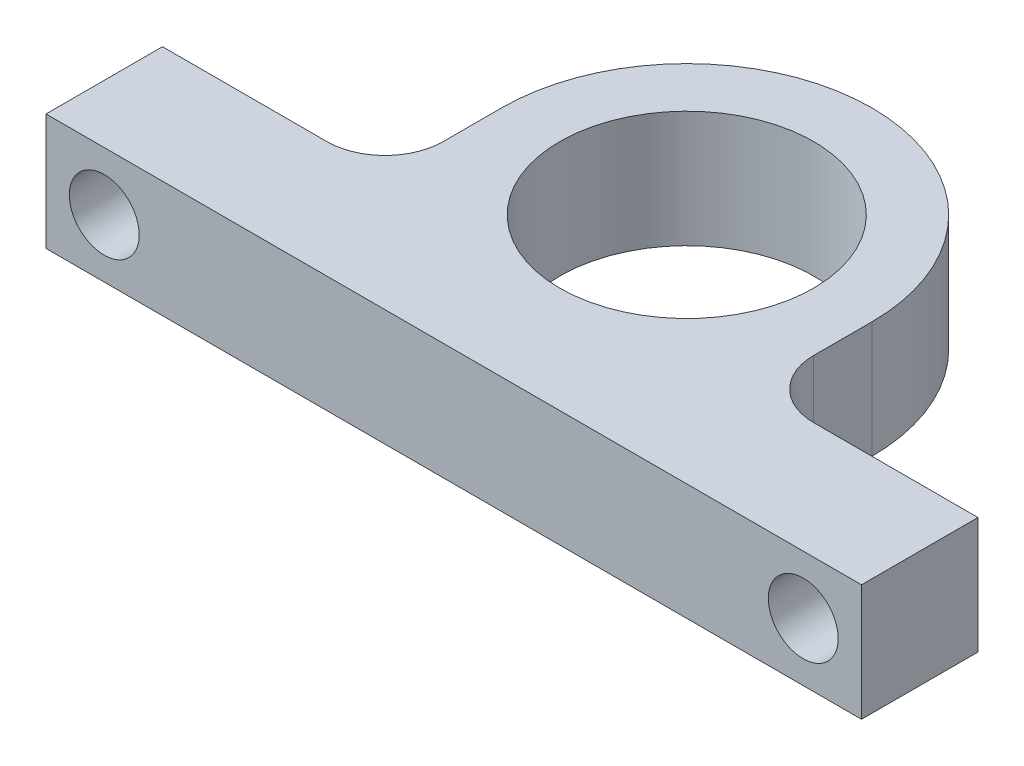
ISO-10303-21;
HEADER;
FILE_DESCRIPTION(('STEP AP214'),'2;1');
FILE_NAME('part.step','',(''),(''),'','','');
FILE_SCHEMA(('AUTOMOTIVE_DESIGN { 1 0 10303 214 1 1 1 1 }'));
ENDSEC;
DATA;
#1=APPLICATION_CONTEXT('core data for automotive mechanical design processes');
#2=APPLICATION_PROTOCOL_DEFINITION('international standard','automotive_design',2000,#1);
#3=PRODUCT_CONTEXT('',#1,'mechanical');
#4=PRODUCT('Part','Part','',(#3));
#5=PRODUCT_RELATED_PRODUCT_CATEGORY('part','',(#4));
#6=PRODUCT_DEFINITION_FORMATION('','',#4);
#7=PRODUCT_DEFINITION_CONTEXT('part definition',#1,'design');
#8=PRODUCT_DEFINITION('design','',#6,#7);
#9=PRODUCT_DEFINITION_SHAPE('','',#8);
#10=(LENGTH_UNIT() NAMED_UNIT(*) SI_UNIT(.MILLI.,.METRE.));
#11=(NAMED_UNIT(*) PLANE_ANGLE_UNIT() SI_UNIT($,.RADIAN.));
#12=(NAMED_UNIT(*) SI_UNIT($,.STERADIAN.) SOLID_ANGLE_UNIT());
#13=UNCERTAINTY_MEASURE_WITH_UNIT(LENGTH_MEASURE(1.E-05),#10,'distance_accuracy_value','');
#14=(GEOMETRIC_REPRESENTATION_CONTEXT(3) GLOBAL_UNCERTAINTY_ASSIGNED_CONTEXT((#13)) GLOBAL_UNIT_ASSIGNED_CONTEXT((#10,
#11,#12)) REPRESENTATION_CONTEXT('',''));
#15=CARTESIAN_POINT('',(0.,0.,0.));
#16=DIRECTION('',(0.,0.,1.));
#17=DIRECTION('',(1.,0.,0.));
#18=AXIS2_PLACEMENT_3D('',#15,#16,#17);
#19=CARTESIAN_POINT('',(0.,10.,-20.));
#20=DIRECTION('',(0.,1.,0.));
#21=DIRECTION('',(0.,0.,1.));
#22=AXIS2_PLACEMENT_3D('',#19,#20,#21);
#23=PLANE('',#22);
#24=CARTESIAN_POINT('',(0.,10.,-20.));
#25=DIRECTION('',(0.,1.,0.));
#26=DIRECTION('',(0.,0.,1.));
#27=AXIS2_PLACEMENT_3D('',#24,#25,#26);
#28=CIRCLE('',#27,15.9);
#29=CARTESIAN_POINT('',(15.9,10.,-20.));
#30=VERTEX_POINT('',#29);
#31=CARTESIAN_POINT('',(-15.9,10.,-20.));
#32=VERTEX_POINT('',#31);
#33=EDGE_CURVE('E130',#30,#32,#28,.T.);
#34=ORIENTED_EDGE('',*,*,#33,.T.);
#35=DIRECTION('',(0.,0.,1.));
#36=VECTOR('',#35,1.);
#37=CARTESIAN_POINT('',(-15.9,10.,-20.));
#38=LINE('',#37,#36);
#39=CARTESIAN_POINT('',(-15.9,10.,-15.));
#40=VERTEX_POINT('',#39);
#41=EDGE_CURVE('E117',#32,#40,#38,.T.);
#42=ORIENTED_EDGE('',*,*,#41,.T.);
#43=CARTESIAN_POINT('',(-20.9,10.,-15.));
#44=DIRECTION('',(0.,1.,0.));
#45=DIRECTION('',(0.,0.,1.));
#46=AXIS2_PLACEMENT_3D('',#43,#44,#45);
#47=CIRCLE('',#46,5.);
#48=CARTESIAN_POINT('',(-20.9,10.,-9.99999999999999));
#49=VERTEX_POINT('',#48);
#50=EDGE_CURVE('E169',#40,#49,#47,.F.);
#51=ORIENTED_EDGE('',*,*,#50,.T.);
#52=DIRECTION('',(-1.,0.,0.));
#53=VECTOR('',#52,1.);
#54=CARTESIAN_POINT('',(-15.9,10.,-9.99999999999999));
#55=LINE('',#54,#53);
#56=CARTESIAN_POINT('',(-35.,10.,-9.99999999999999));
#57=VERTEX_POINT('',#56);
#58=EDGE_CURVE('E129',#49,#57,#55,.T.);
#59=ORIENTED_EDGE('',*,*,#58,.T.);
#60=DIRECTION('',(0.,0.,1.));
#61=VECTOR('',#60,1.);
#62=CARTESIAN_POINT('',(-35.,10.,0.));
#63=LINE('',#62,#61);
#64=CARTESIAN_POINT('',(-35.,10.,0.));
#65=VERTEX_POINT('',#64);
#66=EDGE_CURVE('E181',#57,#65,#63,.T.);
#67=ORIENTED_EDGE('',*,*,#66,.T.);
#68=DIRECTION('',(1.,0.,0.));
#69=VECTOR('',#68,1.);
#70=CARTESIAN_POINT('',(35.,10.,0.));
#71=LINE('',#70,#69);
#72=CARTESIAN_POINT('',(35.,10.,0.));
#73=VERTEX_POINT('',#72);
#74=EDGE_CURVE('E230',#65,#73,#71,.T.);
#75=ORIENTED_EDGE('',*,*,#74,.T.);
#76=DIRECTION('',(0.,0.,-1.));
#77=VECTOR('',#76,1.);
#78=CARTESIAN_POINT('',(35.,10.,0.));
#79=LINE('',#78,#77);
#80=CARTESIAN_POINT('',(35.,10.,-9.99999999999999));
#81=VERTEX_POINT('',#80);
#82=EDGE_CURVE('E241',#73,#81,#79,.T.);
#83=ORIENTED_EDGE('',*,*,#82,.T.);
#84=DIRECTION('',(-1.,0.,0.));
#85=VECTOR('',#84,1.);
#86=CARTESIAN_POINT('',(15.9,10.,-9.99999999999999));
#87=LINE('',#86,#85);
#88=CARTESIAN_POINT('',(20.9,10.,-9.99999999999999));
#89=VERTEX_POINT('',#88);
#90=EDGE_CURVE('E238',#81,#89,#87,.T.);
#91=ORIENTED_EDGE('',*,*,#90,.T.);
#92=CARTESIAN_POINT('',(20.9,10.,-15.));
#93=DIRECTION('',(0.,1.,0.));
#94=DIRECTION('',(0.,0.,1.));
#95=AXIS2_PLACEMENT_3D('',#92,#93,#94);
#96=CIRCLE('',#95,5.);
#97=CARTESIAN_POINT('',(15.9,10.,-15.));
#98=VERTEX_POINT('',#97);
#99=EDGE_CURVE('E11',#89,#98,#96,.F.);
#100=ORIENTED_EDGE('',*,*,#99,.T.);
#101=DIRECTION('',(0.,0.,-1.));
#102=VECTOR('',#101,1.);
#103=CARTESIAN_POINT('',(15.9,10.,-20.));
#104=LINE('',#103,#102);
#105=EDGE_CURVE('E135',#98,#30,#104,.T.);
#106=ORIENTED_EDGE('',*,*,#105,.T.);
#107=EDGE_LOOP('',(#34,#42,#51,#59,#67,#75,#83,#91,#100,#106));
#108=FACE_BOUND('',#107,.T.);
#109=CARTESIAN_POINT('',(0.,10.,-20.));
#110=DIRECTION('',(0.,1.,0.));
#111=DIRECTION('',(0.,0.,1.));
#112=AXIS2_PLACEMENT_3D('',#109,#110,#111);
#113=CIRCLE('',#112,10.9);
#114=CARTESIAN_POINT('',(0.,10.,-9.09999999999999));
#115=VERTEX_POINT('',#114);
#116=EDGE_CURVE('E195',#115,#115,#113,.T.);
#117=ORIENTED_EDGE('',*,*,#116,.F.);
#118=EDGE_LOOP('',(#117));
#119=FACE_BOUND('',#118,.T.);
#120=ADVANCED_FACE('F39',(#108,#119),#23,.T.);
#121=CARTESIAN_POINT('',(0.,0.,-20.));
#122=DIRECTION('',(0.,1.,0.));
#123=DIRECTION('',(0.,0.,1.));
#124=AXIS2_PLACEMENT_3D('',#121,#122,#123);
#125=PLANE('',#124);
#126=CARTESIAN_POINT('',(0.,0.,-20.));
#127=DIRECTION('',(0.,1.,0.));
#128=DIRECTION('',(0.,0.,1.));
#129=AXIS2_PLACEMENT_3D('',#126,#127,#128);
#130=CIRCLE('',#129,15.9);
#131=CARTESIAN_POINT('',(15.9,0.,-20.));
#132=VERTEX_POINT('',#131);
#133=CARTESIAN_POINT('',(-15.9,0.,-20.));
#134=VERTEX_POINT('',#133);
#135=EDGE_CURVE('E144',#132,#134,#130,.T.);
#136=ORIENTED_EDGE('',*,*,#135,.F.);
#137=DIRECTION('',(0.,0.,-1.));
#138=VECTOR('',#137,1.);
#139=CARTESIAN_POINT('',(15.9,0.,-20.));
#140=LINE('',#139,#138);
#141=CARTESIAN_POINT('',(15.9,0.,-15.));
#142=VERTEX_POINT('',#141);
#143=EDGE_CURVE('E140',#142,#132,#140,.T.);
#144=ORIENTED_EDGE('',*,*,#143,.F.);
#145=CARTESIAN_POINT('',(20.9,0.,-15.));
#146=DIRECTION('',(0.,1.,0.));
#147=DIRECTION('',(0.,0.,1.));
#148=AXIS2_PLACEMENT_3D('',#145,#146,#147);
#149=CIRCLE('',#148,5.);
#150=CARTESIAN_POINT('',(20.9,0.,-9.99999999999999));
#151=VERTEX_POINT('',#150);
#152=EDGE_CURVE('E48',#142,#151,#149,.T.);
#153=ORIENTED_EDGE('',*,*,#152,.T.);
#154=DIRECTION('',(-1.,0.,0.));
#155=VECTOR('',#154,1.);
#156=CARTESIAN_POINT('',(15.9,0.,-9.99999999999999));
#157=LINE('',#156,#155);
#158=CARTESIAN_POINT('',(35.,0.,-9.99999999999999));
#159=VERTEX_POINT('',#158);
#160=EDGE_CURVE('E207',#159,#151,#157,.T.);
#161=ORIENTED_EDGE('',*,*,#160,.F.);
#162=DIRECTION('',(0.,0.,-1.));
#163=VECTOR('',#162,1.);
#164=CARTESIAN_POINT('',(35.,0.,0.));
#165=LINE('',#164,#163);
#166=CARTESIAN_POINT('',(35.,0.,0.));
#167=VERTEX_POINT('',#166);
#168=EDGE_CURVE('E204',#167,#159,#165,.T.);
#169=ORIENTED_EDGE('',*,*,#168,.F.);
#170=DIRECTION('',(1.,0.,0.));
#171=VECTOR('',#170,1.);
#172=CARTESIAN_POINT('',(35.,0.,0.));
#173=LINE('',#172,#171);
#174=CARTESIAN_POINT('',(-35.,0.,0.));
#175=VERTEX_POINT('',#174);
#176=EDGE_CURVE('E201',#175,#167,#173,.T.);
#177=ORIENTED_EDGE('',*,*,#176,.F.);
#178=DIRECTION('',(0.,0.,1.));
#179=VECTOR('',#178,1.);
#180=CARTESIAN_POINT('',(-35.,0.,0.));
#181=LINE('',#180,#179);
#182=CARTESIAN_POINT('',(-35.,0.,-9.99999999999999));
#183=VERTEX_POINT('',#182);
#184=EDGE_CURVE('E193',#183,#175,#181,.T.);
#185=ORIENTED_EDGE('',*,*,#184,.F.);
#186=DIRECTION('',(-1.,0.,0.));
#187=VECTOR('',#186,1.);
#188=CARTESIAN_POINT('',(-15.9,0.,-9.99999999999999));
#189=LINE('',#188,#187);
#190=CARTESIAN_POINT('',(-20.9,0.,-9.99999999999999));
#191=VERTEX_POINT('',#190);
#192=EDGE_CURVE('E188',#191,#183,#189,.T.);
#193=ORIENTED_EDGE('',*,*,#192,.F.);
#194=CARTESIAN_POINT('',(-20.9,0.,-15.));
#195=DIRECTION('',(0.,1.,0.));
#196=DIRECTION('',(0.,0.,1.));
#197=AXIS2_PLACEMENT_3D('',#194,#195,#196);
#198=CIRCLE('',#197,5.);
#199=CARTESIAN_POINT('',(-15.9,0.,-15.));
#200=VERTEX_POINT('',#199);
#201=EDGE_CURVE('E166',#191,#200,#198,.T.);
#202=ORIENTED_EDGE('',*,*,#201,.T.);
#203=DIRECTION('',(0.,0.,1.));
#204=VECTOR('',#203,1.);
#205=CARTESIAN_POINT('',(-15.9,0.,-20.));
#206=LINE('',#205,#204);
#207=EDGE_CURVE('E186',#134,#200,#206,.T.);
#208=ORIENTED_EDGE('',*,*,#207,.F.);
#209=EDGE_LOOP('',(#136,#144,#153,#161,#169,#177,#185,#193,#202,#208));
#210=FACE_BOUND('',#209,.T.);
#211=CARTESIAN_POINT('',(0.,0.,-20.));
#212=DIRECTION('',(0.,1.,0.));
#213=DIRECTION('',(0.,0.,1.));
#214=AXIS2_PLACEMENT_3D('',#211,#212,#213);
#215=CIRCLE('',#214,10.9);
#216=CARTESIAN_POINT('',(0.,0.,-9.09999999999999));
#217=VERTEX_POINT('',#216);
#218=EDGE_CURVE('E251',#217,#217,#215,.T.);
#219=ORIENTED_EDGE('',*,*,#218,.T.);
#220=EDGE_LOOP('',(#219));
#221=FACE_BOUND('',#220,.T.);
#222=ADVANCED_FACE('F184',(#210,#221),#125,.F.);
#223=CARTESIAN_POINT('',(0.,10.,-20.));
#224=DIRECTION('',(0.,-1.,0.));
#225=DIRECTION('',(0.,0.,-1.));
#226=AXIS2_PLACEMENT_3D('',#223,#224,#225);
#227=CYLINDRICAL_SURFACE('',#226,15.9);
#228=ORIENTED_EDGE('',*,*,#135,.T.);
#229=DIRECTION('',(0.,-1.,0.));
#230=VECTOR('',#229,1.);
#231=CARTESIAN_POINT('',(-15.9,10.,-20.));
#232=LINE('',#231,#230);
#233=EDGE_CURVE('E122',#32,#134,#232,.T.);
#234=ORIENTED_EDGE('',*,*,#233,.F.);
#235=ORIENTED_EDGE('',*,*,#33,.F.);
#236=DIRECTION('',(0.,-1.,0.));
#237=VECTOR('',#236,1.);
#238=CARTESIAN_POINT('',(15.9,10.,-20.));
#239=LINE('',#238,#237);
#240=EDGE_CURVE('E212',#30,#132,#239,.T.);
#241=ORIENTED_EDGE('',*,*,#240,.T.);
#242=EDGE_LOOP('',(#228,#234,#235,#241));
#243=FACE_BOUND('',#242,.T.);
#244=ADVANCED_FACE('F142',(#243),#227,.T.);
#245=CARTESIAN_POINT('',(-15.9,10.,-20.));
#246=DIRECTION('',(1.,0.,0.));
#247=DIRECTION('',(0.,0.,-1.));
#248=AXIS2_PLACEMENT_3D('',#245,#246,#247);
#249=PLANE('',#248);
#250=ORIENTED_EDGE('',*,*,#207,.T.);
#251=DIRECTION('',(0.,-1.,0.));
#252=VECTOR('',#251,1.);
#253=CARTESIAN_POINT('',(-15.9,10.,-15.));
#254=LINE('',#253,#252);
#255=EDGE_CURVE('E125',#200,#40,#254,.F.);
#256=ORIENTED_EDGE('',*,*,#255,.T.);
#257=ORIENTED_EDGE('',*,*,#41,.F.);
#258=ORIENTED_EDGE('',*,*,#233,.T.);
#259=EDGE_LOOP('',(#250,#256,#257,#258));
#260=FACE_BOUND('',#259,.T.);
#261=ADVANCED_FACE('F120',(#260),#249,.F.);
#262=CARTESIAN_POINT('',(-15.9,10.,-9.99999999999999));
#263=DIRECTION('',(0.,0.,1.));
#264=DIRECTION('',(1.,0.,0.));
#265=AXIS2_PLACEMENT_3D('',#262,#263,#264);
#266=PLANE('',#265);
#267=CARTESIAN_POINT('',(-30.,5.,-9.99999999999999));
#268=DIRECTION('',(0.,0.,-1.));
#269=DIRECTION('',(-1.,0.,0.));
#270=AXIS2_PLACEMENT_3D('',#267,#268,#269);
#271=CIRCLE('',#270,3.);
#272=CARTESIAN_POINT('',(-33.,5.,-9.99999999999999));
#273=VERTEX_POINT('',#272);
#274=EDGE_CURVE('E259',#273,#273,#271,.T.);
#275=ORIENTED_EDGE('',*,*,#274,.F.);
#276=EDGE_LOOP('',(#275));
#277=FACE_BOUND('',#276,.T.);
#278=ORIENTED_EDGE('',*,*,#58,.F.);
#279=DIRECTION('',(0.,-1.,0.));
#280=VECTOR('',#279,1.);
#281=CARTESIAN_POINT('',(-20.9,0.,-9.99999999999999));
#282=LINE('',#281,#280);
#283=EDGE_CURVE('E146',#49,#191,#282,.T.);
#284=ORIENTED_EDGE('',*,*,#283,.T.);
#285=ORIENTED_EDGE('',*,*,#192,.T.);
#286=DIRECTION('',(0.,-1.,0.));
#287=VECTOR('',#286,1.);
#288=CARTESIAN_POINT('',(-35.,10.,-9.99999999999999));
#289=LINE('',#288,#287);
#290=EDGE_CURVE('E147',#57,#183,#289,.T.);
#291=ORIENTED_EDGE('',*,*,#290,.F.);
#292=EDGE_LOOP('',(#278,#284,#285,#291));
#293=FACE_BOUND('',#292,.T.);
#294=ADVANCED_FACE('F177',(#277,#293),#266,.F.);
#295=CARTESIAN_POINT('',(-35.,10.,0.));
#296=DIRECTION('',(1.,0.,0.));
#297=DIRECTION('',(0.,0.,-1.));
#298=AXIS2_PLACEMENT_3D('',#295,#296,#297);
#299=PLANE('',#298);
#300=ORIENTED_EDGE('',*,*,#184,.T.);
#301=DIRECTION('',(0.,-1.,0.));
#302=VECTOR('',#301,1.);
#303=CARTESIAN_POINT('',(-35.,10.,0.));
#304=LINE('',#303,#302);
#305=EDGE_CURVE('E154',#65,#175,#304,.T.);
#306=ORIENTED_EDGE('',*,*,#305,.F.);
#307=ORIENTED_EDGE('',*,*,#66,.F.);
#308=ORIENTED_EDGE('',*,*,#290,.T.);
#309=EDGE_LOOP('',(#300,#306,#307,#308));
#310=FACE_BOUND('',#309,.T.);
#311=ADVANCED_FACE('F314',(#310),#299,.F.);
#312=CARTESIAN_POINT('',(35.,10.,0.));
#313=DIRECTION('',(0.,0.,-1.));
#314=DIRECTION('',(-1.,0.,0.));
#315=AXIS2_PLACEMENT_3D('',#312,#313,#314);
#316=PLANE('',#315);
#317=CARTESIAN_POINT('',(30.,5.,0.));
#318=DIRECTION('',(0.,0.,-1.));
#319=DIRECTION('',(-1.,0.,0.));
#320=AXIS2_PLACEMENT_3D('',#317,#318,#319);
#321=CIRCLE('',#320,3.);
#322=CARTESIAN_POINT('',(27.,5.,0.));
#323=VERTEX_POINT('',#322);
#324=EDGE_CURVE('E255',#323,#323,#321,.T.);
#325=ORIENTED_EDGE('',*,*,#324,.T.);
#326=EDGE_LOOP('',(#325));
#327=FACE_BOUND('',#326,.T.);
#328=CARTESIAN_POINT('',(-30.,5.,0.));
#329=DIRECTION('',(0.,0.,-1.));
#330=DIRECTION('',(-1.,0.,0.));
#331=AXIS2_PLACEMENT_3D('',#328,#329,#330);
#332=CIRCLE('',#331,3.);
#333=CARTESIAN_POINT('',(-33.,5.,0.));
#334=VERTEX_POINT('',#333);
#335=EDGE_CURVE('E263',#334,#334,#332,.T.);
#336=ORIENTED_EDGE('',*,*,#335,.T.);
#337=EDGE_LOOP('',(#336));
#338=FACE_BOUND('',#337,.T.);
#339=ORIENTED_EDGE('',*,*,#176,.T.);
#340=DIRECTION('',(0.,-1.,0.));
#341=VECTOR('',#340,1.);
#342=CARTESIAN_POINT('',(35.,10.,0.));
#343=LINE('',#342,#341);
#344=EDGE_CURVE('E219',#73,#167,#343,.T.);
#345=ORIENTED_EDGE('',*,*,#344,.F.);
#346=ORIENTED_EDGE('',*,*,#74,.F.);
#347=ORIENTED_EDGE('',*,*,#305,.T.);
#348=EDGE_LOOP('',(#339,#345,#346,#347));
#349=FACE_BOUND('',#348,.T.);
#350=ADVANCED_FACE('F228',(#327,#338,#349),#316,.F.);
#351=CARTESIAN_POINT('',(35.,10.,0.));
#352=DIRECTION('',(-1.,0.,0.));
#353=DIRECTION('',(0.,0.,1.));
#354=AXIS2_PLACEMENT_3D('',#351,#352,#353);
#355=PLANE('',#354);
#356=ORIENTED_EDGE('',*,*,#168,.T.);
#357=DIRECTION('',(0.,-1.,0.));
#358=VECTOR('',#357,1.);
#359=CARTESIAN_POINT('',(35.,10.,-9.99999999999999));
#360=LINE('',#359,#358);
#361=EDGE_CURVE('E215',#81,#159,#360,.T.);
#362=ORIENTED_EDGE('',*,*,#361,.F.);
#363=ORIENTED_EDGE('',*,*,#82,.F.);
#364=ORIENTED_EDGE('',*,*,#344,.T.);
#365=EDGE_LOOP('',(#356,#362,#363,#364));
#366=FACE_BOUND('',#365,.T.);
#367=ADVANCED_FACE('F235',(#366),#355,.F.);
#368=CARTESIAN_POINT('',(15.9,10.,-9.99999999999999));
#369=DIRECTION('',(0.,0.,1.));
#370=DIRECTION('',(1.,0.,0.));
#371=AXIS2_PLACEMENT_3D('',#368,#369,#370);
#372=PLANE('',#371);
#373=CARTESIAN_POINT('',(30.,5.,-9.99999999999999));
#374=DIRECTION('',(0.,0.,-1.));
#375=DIRECTION('',(-1.,0.,0.));
#376=AXIS2_PLACEMENT_3D('',#373,#374,#375);
#377=CIRCLE('',#376,3.);
#378=CARTESIAN_POINT('',(27.,5.,-9.99999999999999));
#379=VERTEX_POINT('',#378);
#380=EDGE_CURVE('E267',#379,#379,#377,.T.);
#381=ORIENTED_EDGE('',*,*,#380,.F.);
#382=EDGE_LOOP('',(#381));
#383=FACE_BOUND('',#382,.T.);
#384=ORIENTED_EDGE('',*,*,#160,.T.);
#385=DIRECTION('',(0.,-1.,0.));
#386=VECTOR('',#385,1.);
#387=CARTESIAN_POINT('',(20.9,10.,-9.99999999999999));
#388=LINE('',#387,#386);
#389=EDGE_CURVE('E55',#151,#89,#388,.F.);
#390=ORIENTED_EDGE('',*,*,#389,.T.);
#391=ORIENTED_EDGE('',*,*,#90,.F.);
#392=ORIENTED_EDGE('',*,*,#361,.T.);
#393=EDGE_LOOP('',(#384,#390,#391,#392));
#394=FACE_BOUND('',#393,.T.);
#395=ADVANCED_FACE('F237',(#383,#394),#372,.F.);
#396=CARTESIAN_POINT('',(15.9,10.,-20.));
#397=DIRECTION('',(-1.,0.,0.));
#398=DIRECTION('',(0.,0.,1.));
#399=AXIS2_PLACEMENT_3D('',#396,#397,#398);
#400=PLANE('',#399);
#401=ORIENTED_EDGE('',*,*,#105,.F.);
#402=DIRECTION('',(0.,-1.,0.));
#403=VECTOR('',#402,1.);
#404=CARTESIAN_POINT('',(15.9,0.,-15.));
#405=LINE('',#404,#403);
#406=EDGE_CURVE('E160',#98,#142,#405,.T.);
#407=ORIENTED_EDGE('',*,*,#406,.T.);
#408=ORIENTED_EDGE('',*,*,#143,.T.);
#409=ORIENTED_EDGE('',*,*,#240,.F.);
#410=EDGE_LOOP('',(#401,#407,#408,#409));
#411=FACE_BOUND('',#410,.T.);
#412=ADVANCED_FACE('F285',(#411),#400,.F.);
#413=CARTESIAN_POINT('',(0.,10.,-20.));
#414=DIRECTION('',(0.,-1.,0.));
#415=DIRECTION('',(0.,0.,-1.));
#416=AXIS2_PLACEMENT_3D('',#413,#414,#415);
#417=CYLINDRICAL_SURFACE('',#416,10.9);
#418=ORIENTED_EDGE('',*,*,#116,.T.);
#419=EDGE_LOOP('',(#418));
#420=FACE_BOUND('',#419,.T.);
#421=ORIENTED_EDGE('',*,*,#218,.F.);
#422=EDGE_LOOP('',(#421));
#423=FACE_BOUND('',#422,.T.);
#424=ADVANCED_FACE('F291',(#420,#423),#417,.F.);
#425=CARTESIAN_POINT('',(-20.9,10.,-15.));
#426=DIRECTION('',(0.,1.,0.));
#427=DIRECTION('',(0.,0.,1.));
#428=AXIS2_PLACEMENT_3D('',#425,#426,#427);
#429=CYLINDRICAL_SURFACE('',#428,5.);
#430=ORIENTED_EDGE('',*,*,#50,.F.);
#431=ORIENTED_EDGE('',*,*,#255,.F.);
#432=ORIENTED_EDGE('',*,*,#201,.F.);
#433=ORIENTED_EDGE('',*,*,#283,.F.);
#434=EDGE_LOOP('',(#430,#431,#432,#433));
#435=FACE_BOUND('',#434,.T.);
#436=ADVANCED_FACE('F183',(#435),#429,.F.);
#437=CARTESIAN_POINT('',(20.9,10.,-15.));
#438=DIRECTION('',(0.,1.,0.));
#439=DIRECTION('',(0.,0.,1.));
#440=AXIS2_PLACEMENT_3D('',#437,#438,#439);
#441=CYLINDRICAL_SURFACE('',#440,5.);
#442=ORIENTED_EDGE('',*,*,#99,.F.);
#443=ORIENTED_EDGE('',*,*,#389,.F.);
#444=ORIENTED_EDGE('',*,*,#152,.F.);
#445=ORIENTED_EDGE('',*,*,#406,.F.);
#446=EDGE_LOOP('',(#442,#443,#444,#445));
#447=FACE_BOUND('',#446,.T.);
#448=ADVANCED_FACE('F41',(#447),#441,.F.);
#449=CARTESIAN_POINT('',(30.,5.,0.));
#450=DIRECTION('',(0.,0.,-1.));
#451=DIRECTION('',(-1.,0.,0.));
#452=AXIS2_PLACEMENT_3D('',#449,#450,#451);
#453=CYLINDRICAL_SURFACE('',#452,3.);
#454=ORIENTED_EDGE('',*,*,#324,.F.);
#455=EDGE_LOOP('',(#454));
#456=FACE_BOUND('',#455,.T.);
#457=ORIENTED_EDGE('',*,*,#380,.T.);
#458=EDGE_LOOP('',(#457));
#459=FACE_BOUND('',#458,.T.);
#460=ADVANCED_FACE('F277',(#456,#459),#453,.F.);
#461=CARTESIAN_POINT('',(-30.,5.,0.));
#462=DIRECTION('',(0.,0.,-1.));
#463=DIRECTION('',(-1.,0.,0.));
#464=AXIS2_PLACEMENT_3D('',#461,#462,#463);
#465=CYLINDRICAL_SURFACE('',#464,3.);
#466=ORIENTED_EDGE('',*,*,#335,.F.);
#467=EDGE_LOOP('',(#466));
#468=FACE_BOUND('',#467,.T.);
#469=ORIENTED_EDGE('',*,*,#274,.T.);
#470=EDGE_LOOP('',(#469));
#471=FACE_BOUND('',#470,.T.);
#472=ADVANCED_FACE('F280',(#468,#471),#465,.F.);
#473=CLOSED_SHELL('',(#120,#222,#244,#261,#294,#311,#350,#367,#395,#412,#424,#436,#448,#460,#472));
#474=MANIFOLD_SOLID_BREP('B2',#473);
#475=ADVANCED_BREP_SHAPE_REPRESENTATION('',(#18,#474),#14);
#476=SHAPE_DEFINITION_REPRESENTATION(#9,#475);
ENDSEC;
END-ISO-10303-21;
